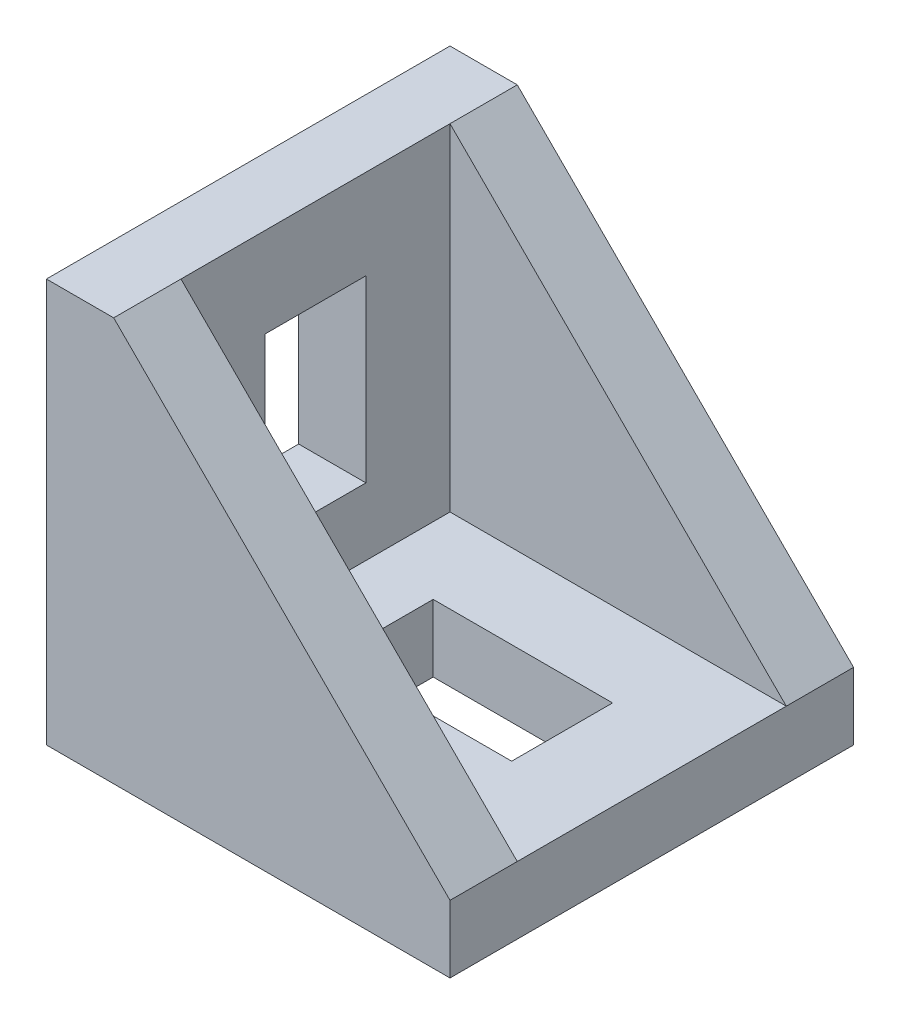
ISO-10303-21;
HEADER;
FILE_DESCRIPTION(('STEP AP214'),'2;1');
FILE_NAME('part.step','',(''),(''),'','','');
FILE_SCHEMA(('AUTOMOTIVE_DESIGN { 1 0 10303 214 1 1 1 1 }'));
ENDSEC;
DATA;
#1=APPLICATION_CONTEXT('core data for automotive mechanical design processes');
#2=APPLICATION_PROTOCOL_DEFINITION('international standard','automotive_design',2000,#1);
#3=PRODUCT_CONTEXT('',#1,'mechanical');
#4=PRODUCT('Part','Part','',(#3));
#5=PRODUCT_RELATED_PRODUCT_CATEGORY('part','',(#4));
#6=PRODUCT_DEFINITION_FORMATION('','',#4);
#7=PRODUCT_DEFINITION_CONTEXT('part definition',#1,'design');
#8=PRODUCT_DEFINITION('design','',#6,#7);
#9=PRODUCT_DEFINITION_SHAPE('','',#8);
#10=(LENGTH_UNIT() NAMED_UNIT(*) SI_UNIT(.MILLI.,.METRE.));
#11=(NAMED_UNIT(*) PLANE_ANGLE_UNIT() SI_UNIT($,.RADIAN.));
#12=(NAMED_UNIT(*) SI_UNIT($,.STERADIAN.) SOLID_ANGLE_UNIT());
#13=UNCERTAINTY_MEASURE_WITH_UNIT(LENGTH_MEASURE(1.E-05),#10,'distance_accuracy_value','');
#14=(GEOMETRIC_REPRESENTATION_CONTEXT(3) GLOBAL_UNCERTAINTY_ASSIGNED_CONTEXT((#13)) GLOBAL_UNIT_ASSIGNED_CONTEXT((#10,
#11,#12)) REPRESENTATION_CONTEXT('',''));
#15=CARTESIAN_POINT('',(0.,0.,0.));
#16=DIRECTION('',(0.,0.,1.));
#17=DIRECTION('',(1.,0.,0.));
#18=AXIS2_PLACEMENT_3D('',#15,#16,#17);
#19=CARTESIAN_POINT('',(9.,9.,9.));
#20=DIRECTION('',(0.,0.,1.));
#21=DIRECTION('',(1.,0.,0.));
#22=AXIS2_PLACEMENT_3D('',#19,#20,#21);
#23=PLANE('',#22);
#24=DIRECTION('',(-1.,0.,0.));
#25=VECTOR('',#24,1.);
#26=CARTESIAN_POINT('',(3.,18.,9.));
#27=LINE('',#26,#25);
#28=CARTESIAN_POINT('',(3.,18.,9.));
#29=VERTEX_POINT('',#28);
#30=CARTESIAN_POINT('',(0.,18.,9.));
#31=VERTEX_POINT('',#30);
#32=EDGE_CURVE('E10',#29,#31,#27,.T.);
#33=ORIENTED_EDGE('',*,*,#32,.T.);
#34=DIRECTION('',(0.,-1.,0.));
#35=VECTOR('',#34,1.);
#36=CARTESIAN_POINT('',(0.,18.,9.));
#37=LINE('',#36,#35);
#38=CARTESIAN_POINT('',(0.,0.,9.));
#39=VERTEX_POINT('',#38);
#40=EDGE_CURVE('E163',#31,#39,#37,.T.);
#41=ORIENTED_EDGE('',*,*,#40,.T.);
#42=DIRECTION('',(1.,0.,0.));
#43=VECTOR('',#42,1.);
#44=CARTESIAN_POINT('',(0.,0.,9.));
#45=LINE('',#44,#43);
#46=CARTESIAN_POINT('',(18.,0.,9.));
#47=VERTEX_POINT('',#46);
#48=EDGE_CURVE('E157',#39,#47,#45,.T.);
#49=ORIENTED_EDGE('',*,*,#48,.T.);
#50=DIRECTION('',(0.,1.,0.));
#51=VECTOR('',#50,1.);
#52=CARTESIAN_POINT('',(18.,0.,9.));
#53=LINE('',#52,#51);
#54=CARTESIAN_POINT('',(18.,3.,9.));
#55=VERTEX_POINT('',#54);
#56=EDGE_CURVE('E160',#47,#55,#53,.T.);
#57=ORIENTED_EDGE('',*,*,#56,.T.);
#58=DIRECTION('',(0.707106781186547,-0.707106781186548,0.));
#59=VECTOR('',#58,1.);
#60=CARTESIAN_POINT('',(3.,18.,9.));
#61=LINE('',#60,#59);
#62=EDGE_CURVE('E276',#29,#55,#61,.T.);
#63=ORIENTED_EDGE('',*,*,#62,.F.);
#64=EDGE_LOOP('',(#33,#41,#49,#57,#63));
#65=FACE_BOUND('',#64,.T.);
#66=ADVANCED_FACE('F16',(#65),#23,.T.);
#67=CARTESIAN_POINT('',(3.,18.,0.));
#68=DIRECTION('',(0.,1.,0.));
#69=DIRECTION('',(1.,0.,0.));
#70=AXIS2_PLACEMENT_3D('',#67,#68,#69);
#71=PLANE('',#70);
#72=DIRECTION('',(0.,0.,1.));
#73=VECTOR('',#72,1.);
#74=CARTESIAN_POINT('',(0.,18.,0.));
#75=LINE('',#74,#73);
#76=CARTESIAN_POINT('',(0.,18.,-9.));
#77=VERTEX_POINT('',#76);
#78=EDGE_CURVE('E25',#77,#31,#75,.T.);
#79=ORIENTED_EDGE('',*,*,#78,.T.);
#80=ORIENTED_EDGE('',*,*,#32,.F.);
#81=DIRECTION('',(0.,0.,-1.));
#82=VECTOR('',#81,1.);
#83=CARTESIAN_POINT('',(3.,18.,0.));
#84=LINE('',#83,#82);
#85=CARTESIAN_POINT('',(3.,18.,6.));
#86=VERTEX_POINT('',#85);
#87=EDGE_CURVE('E265',#29,#86,#84,.T.);
#88=ORIENTED_EDGE('',*,*,#87,.T.);
#89=DIRECTION('',(0.,0.,-1.));
#90=VECTOR('',#89,1.);
#91=CARTESIAN_POINT('',(3.,18.,0.));
#92=LINE('',#91,#90);
#93=CARTESIAN_POINT('',(3.,18.,-6.));
#94=VERTEX_POINT('',#93);
#95=EDGE_CURVE('E297',#86,#94,#92,.T.);
#96=ORIENTED_EDGE('',*,*,#95,.T.);
#97=DIRECTION('',(0.,0.,-1.));
#98=VECTOR('',#97,1.);
#99=CARTESIAN_POINT('',(3.,18.,0.));
#100=LINE('',#99,#98);
#101=CARTESIAN_POINT('',(3.,18.,-9.));
#102=VERTEX_POINT('',#101);
#103=EDGE_CURVE('E342',#94,#102,#100,.T.);
#104=ORIENTED_EDGE('',*,*,#103,.T.);
#105=DIRECTION('',(1.,0.,0.));
#106=VECTOR('',#105,1.);
#107=CARTESIAN_POINT('',(3.,18.,-9.));
#108=LINE('',#107,#106);
#109=EDGE_CURVE('E206',#77,#102,#108,.T.);
#110=ORIENTED_EDGE('',*,*,#109,.F.);
#111=EDGE_LOOP('',(#79,#80,#88,#96,#104,#110));
#112=FACE_BOUND('',#111,.T.);
#113=ADVANCED_FACE('F203',(#112),#71,.T.);
#114=CARTESIAN_POINT('',(0.,18.,0.));
#115=DIRECTION('',(-1.,0.,0.));
#116=DIRECTION('',(0.,0.,1.));
#117=AXIS2_PLACEMENT_3D('',#114,#115,#116);
#118=PLANE('',#117);
#119=DIRECTION('',(0.,0.,-1.));
#120=VECTOR('',#119,1.);
#121=CARTESIAN_POINT('',(0.,6.00000020861626,1.125));
#122=LINE('',#121,#120);
#123=CARTESIAN_POINT('',(0.,6.00000020861626,2.25));
#124=VERTEX_POINT('',#123);
#125=CARTESIAN_POINT('',(0.,6.00000020861626,-2.25));
#126=VERTEX_POINT('',#125);
#127=EDGE_CURVE('E247',#124,#126,#122,.T.);
#128=ORIENTED_EDGE('',*,*,#127,.T.);
#129=DIRECTION('',(0.,1.,0.));
#130=VECTOR('',#129,1.);
#131=CARTESIAN_POINT('',(0.,12.0000001043081,-2.25));
#132=LINE('',#131,#130);
#133=CARTESIAN_POINT('',(0.,14.0000002086163,-2.25));
#134=VERTEX_POINT('',#133);
#135=EDGE_CURVE('E252',#126,#134,#132,.T.);
#136=ORIENTED_EDGE('',*,*,#135,.T.);
#137=DIRECTION('',(0.,0.,1.));
#138=VECTOR('',#137,1.);
#139=CARTESIAN_POINT('',(0.,14.0000002086163,-1.125));
#140=LINE('',#139,#138);
#141=CARTESIAN_POINT('',(0.,14.0000002086163,2.25));
#142=VERTEX_POINT('',#141);
#143=EDGE_CURVE('E258',#134,#142,#140,.T.);
#144=ORIENTED_EDGE('',*,*,#143,.T.);
#145=DIRECTION('',(0.,-1.,0.));
#146=VECTOR('',#145,1.);
#147=CARTESIAN_POINT('',(0.,16.0000001043081,2.25));
#148=LINE('',#147,#146);
#149=EDGE_CURVE('E244',#142,#124,#148,.T.);
#150=ORIENTED_EDGE('',*,*,#149,.T.);
#151=EDGE_LOOP('',(#128,#136,#144,#150));
#152=FACE_BOUND('',#151,.T.);
#153=DIRECTION('',(0.,0.,1.));
#154=VECTOR('',#153,1.);
#155=CARTESIAN_POINT('',(0.,0.,0.));
#156=LINE('',#155,#154);
#157=CARTESIAN_POINT('',(0.,0.,-9.));
#158=VERTEX_POINT('',#157);
#159=EDGE_CURVE('E167',#158,#39,#156,.T.);
#160=ORIENTED_EDGE('',*,*,#159,.T.);
#161=ORIENTED_EDGE('',*,*,#40,.F.);
#162=ORIENTED_EDGE('',*,*,#78,.F.);
#163=DIRECTION('',(0.,1.,0.));
#164=VECTOR('',#163,1.);
#165=CARTESIAN_POINT('',(0.,18.,-9.));
#166=LINE('',#165,#164);
#167=EDGE_CURVE('E185',#158,#77,#166,.T.);
#168=ORIENTED_EDGE('',*,*,#167,.F.);
#169=EDGE_LOOP('',(#160,#161,#162,#168));
#170=FACE_BOUND('',#169,.T.);
#171=ADVANCED_FACE('F209',(#152,#170),#118,.T.);
#172=CARTESIAN_POINT('',(0.,0.,0.));
#173=DIRECTION('',(0.,-1.,0.));
#174=DIRECTION('',(-1.,0.,0.));
#175=AXIS2_PLACEMENT_3D('',#172,#173,#174);
#176=PLANE('',#175);
#177=DIRECTION('',(-1.,0.,0.));
#178=VECTOR('',#177,1.);
#179=CARTESIAN_POINT('',(7.,0.,-2.25));
#180=LINE('',#179,#178);
#181=CARTESIAN_POINT('',(14.,0.,-2.25));
#182=VERTEX_POINT('',#181);
#183=CARTESIAN_POINT('',(6.,0.,-2.25));
#184=VERTEX_POINT('',#183);
#185=EDGE_CURVE('E228',#182,#184,#180,.T.);
#186=ORIENTED_EDGE('',*,*,#185,.T.);
#187=DIRECTION('',(0.,0.,1.));
#188=VECTOR('',#187,1.);
#189=CARTESIAN_POINT('',(6.,0.,-1.125));
#190=LINE('',#189,#188);
#191=CARTESIAN_POINT('',(6.,0.,2.25));
#192=VERTEX_POINT('',#191);
#193=EDGE_CURVE('E234',#184,#192,#190,.T.);
#194=ORIENTED_EDGE('',*,*,#193,.T.);
#195=DIRECTION('',(1.,0.,0.));
#196=VECTOR('',#195,1.);
#197=CARTESIAN_POINT('',(3.,0.,2.25));
#198=LINE('',#197,#196);
#199=CARTESIAN_POINT('',(14.,0.,2.25));
#200=VERTEX_POINT('',#199);
#201=EDGE_CURVE('E240',#192,#200,#198,.T.);
#202=ORIENTED_EDGE('',*,*,#201,.T.);
#203=DIRECTION('',(0.,0.,-1.));
#204=VECTOR('',#203,1.);
#205=CARTESIAN_POINT('',(14.,0.,1.125));
#206=LINE('',#205,#204);
#207=EDGE_CURVE('E222',#200,#182,#206,.T.);
#208=ORIENTED_EDGE('',*,*,#207,.T.);
#209=EDGE_LOOP('',(#186,#194,#202,#208));
#210=FACE_BOUND('',#209,.T.);
#211=DIRECTION('',(0.,0.,1.));
#212=VECTOR('',#211,1.);
#213=CARTESIAN_POINT('',(18.,0.,0.));
#214=LINE('',#213,#212);
#215=CARTESIAN_POINT('',(18.,0.,-9.));
#216=VERTEX_POINT('',#215);
#217=EDGE_CURVE('E168',#216,#47,#214,.T.);
#218=ORIENTED_EDGE('',*,*,#217,.T.);
#219=ORIENTED_EDGE('',*,*,#48,.F.);
#220=ORIENTED_EDGE('',*,*,#159,.F.);
#221=DIRECTION('',(-1.,0.,0.));
#222=VECTOR('',#221,1.);
#223=CARTESIAN_POINT('',(0.,0.,-9.));
#224=LINE('',#223,#222);
#225=EDGE_CURVE('E173',#216,#158,#224,.T.);
#226=ORIENTED_EDGE('',*,*,#225,.F.);
#227=EDGE_LOOP('',(#218,#219,#220,#226));
#228=FACE_BOUND('',#227,.T.);
#229=ADVANCED_FACE('F171',(#210,#228),#176,.T.);
#230=CARTESIAN_POINT('',(18.,0.,0.));
#231=DIRECTION('',(1.,0.,0.));
#232=DIRECTION('',(0.,1.,0.));
#233=AXIS2_PLACEMENT_3D('',#230,#231,#232);
#234=PLANE('',#233);
#235=DIRECTION('',(0.,0.,1.));
#236=VECTOR('',#235,1.);
#237=CARTESIAN_POINT('',(18.,3.,0.));
#238=LINE('',#237,#236);
#239=CARTESIAN_POINT('',(18.,3.,-9.));
#240=VERTEX_POINT('',#239);
#241=CARTESIAN_POINT('',(18.,3.,-6.));
#242=VERTEX_POINT('',#241);
#243=EDGE_CURVE('E327',#240,#242,#238,.T.);
#244=ORIENTED_EDGE('',*,*,#243,.T.);
#245=DIRECTION('',(0.,0.,1.));
#246=VECTOR('',#245,1.);
#247=CARTESIAN_POINT('',(18.,3.,0.));
#248=LINE('',#247,#246);
#249=CARTESIAN_POINT('',(18.,3.,6.));
#250=VERTEX_POINT('',#249);
#251=EDGE_CURVE('E308',#242,#250,#248,.T.);
#252=ORIENTED_EDGE('',*,*,#251,.T.);
#253=DIRECTION('',(0.,0.,1.));
#254=VECTOR('',#253,1.);
#255=CARTESIAN_POINT('',(18.,3.,0.));
#256=LINE('',#255,#254);
#257=EDGE_CURVE('E182',#250,#55,#256,.T.);
#258=ORIENTED_EDGE('',*,*,#257,.T.);
#259=ORIENTED_EDGE('',*,*,#56,.F.);
#260=ORIENTED_EDGE('',*,*,#217,.F.);
#261=DIRECTION('',(0.,-1.,0.));
#262=VECTOR('',#261,1.);
#263=CARTESIAN_POINT('',(18.,0.,-9.));
#264=LINE('',#263,#262);
#265=EDGE_CURVE('E213',#240,#216,#264,.T.);
#266=ORIENTED_EDGE('',*,*,#265,.F.);
#267=EDGE_LOOP('',(#244,#252,#258,#259,#260,#266));
#268=FACE_BOUND('',#267,.T.);
#269=ADVANCED_FACE('F179',(#268),#234,.T.);
#270=CARTESIAN_POINT('',(9.,9.,-9.));
#271=DIRECTION('',(0.,0.,-1.));
#272=DIRECTION('',(0.,-1.,0.));
#273=AXIS2_PLACEMENT_3D('',#270,#271,#272);
#274=PLANE('',#273);
#275=ORIENTED_EDGE('',*,*,#109,.T.);
#276=DIRECTION('',(0.707106781186547,-0.707106781186548,0.));
#277=VECTOR('',#276,1.);
#278=CARTESIAN_POINT('',(3.,18.,-9.));
#279=LINE('',#278,#277);
#280=EDGE_CURVE('E345',#102,#240,#279,.T.);
#281=ORIENTED_EDGE('',*,*,#280,.T.);
#282=ORIENTED_EDGE('',*,*,#265,.T.);
#283=ORIENTED_EDGE('',*,*,#225,.T.);
#284=ORIENTED_EDGE('',*,*,#167,.T.);
#285=EDGE_LOOP('',(#275,#281,#282,#283,#284));
#286=FACE_BOUND('',#285,.T.);
#287=ADVANCED_FACE('F211',(#286),#274,.T.);
#288=CARTESIAN_POINT('',(14.,0.,2.25));
#289=DIRECTION('',(1.,0.,0.));
#290=DIRECTION('',(0.,-1.,0.));
#291=AXIS2_PLACEMENT_3D('',#288,#289,#290);
#292=PLANE('',#291);
#293=DIRECTION('',(0.,0.,1.));
#294=VECTOR('',#293,1.);
#295=CARTESIAN_POINT('',(14.,3.,1.125));
#296=LINE('',#295,#294);
#297=CARTESIAN_POINT('',(14.,3.,-2.25));
#298=VERTEX_POINT('',#297);
#299=CARTESIAN_POINT('',(14.,3.,2.25));
#300=VERTEX_POINT('',#299);
#301=EDGE_CURVE('E303',#298,#300,#296,.T.);
#302=ORIENTED_EDGE('',*,*,#301,.F.);
#303=DIRECTION('',(0.,1.,0.));
#304=VECTOR('',#303,1.);
#305=CARTESIAN_POINT('',(14.,0.,-2.25));
#306=LINE('',#305,#304);
#307=EDGE_CURVE('E225',#182,#298,#306,.T.);
#308=ORIENTED_EDGE('',*,*,#307,.F.);
#309=ORIENTED_EDGE('',*,*,#207,.F.);
#310=DIRECTION('',(0.,1.,0.));
#311=VECTOR('',#310,1.);
#312=CARTESIAN_POINT('',(14.,0.,2.25));
#313=LINE('',#312,#311);
#314=EDGE_CURVE('E241',#200,#300,#313,.T.);
#315=ORIENTED_EDGE('',*,*,#314,.T.);
#316=EDGE_LOOP('',(#302,#308,#309,#315));
#317=FACE_BOUND('',#316,.T.);
#318=ADVANCED_FACE('F403',(#317),#292,.F.);
#319=CARTESIAN_POINT('',(14.,0.,-2.25));
#320=DIRECTION('',(0.,0.,-1.));
#321=DIRECTION('',(0.,-1.,0.));
#322=AXIS2_PLACEMENT_3D('',#319,#320,#321);
#323=PLANE('',#322);
#324=DIRECTION('',(1.,0.,0.));
#325=VECTOR('',#324,1.);
#326=CARTESIAN_POINT('',(16.,3.,-2.25));
#327=LINE('',#326,#325);
#328=CARTESIAN_POINT('',(6.,3.,-2.25));
#329=VERTEX_POINT('',#328);
#330=EDGE_CURVE('E307',#329,#298,#327,.T.);
#331=ORIENTED_EDGE('',*,*,#330,.F.);
#332=DIRECTION('',(0.,1.,0.));
#333=VECTOR('',#332,1.);
#334=CARTESIAN_POINT('',(6.,0.,-2.25));
#335=LINE('',#334,#333);
#336=EDGE_CURVE('E231',#184,#329,#335,.T.);
#337=ORIENTED_EDGE('',*,*,#336,.F.);
#338=ORIENTED_EDGE('',*,*,#185,.F.);
#339=ORIENTED_EDGE('',*,*,#307,.T.);
#340=EDGE_LOOP('',(#331,#337,#338,#339));
#341=FACE_BOUND('',#340,.T.);
#342=ADVANCED_FACE('F404',(#341),#323,.F.);
#343=CARTESIAN_POINT('',(6.,0.,-2.25));
#344=DIRECTION('',(-1.,0.,0.));
#345=DIRECTION('',(0.,0.,1.));
#346=AXIS2_PLACEMENT_3D('',#343,#344,#345);
#347=PLANE('',#346);
#348=DIRECTION('',(0.,0.,-1.));
#349=VECTOR('',#348,1.);
#350=CARTESIAN_POINT('',(6.,3.,-1.125));
#351=LINE('',#350,#349);
#352=CARTESIAN_POINT('',(6.,3.,2.25));
#353=VERTEX_POINT('',#352);
#354=EDGE_CURVE('E298',#353,#329,#351,.T.);
#355=ORIENTED_EDGE('',*,*,#354,.F.);
#356=DIRECTION('',(0.,1.,0.));
#357=VECTOR('',#356,1.);
#358=CARTESIAN_POINT('',(6.,0.,2.25));
#359=LINE('',#358,#357);
#360=EDGE_CURVE('E237',#192,#353,#359,.T.);
#361=ORIENTED_EDGE('',*,*,#360,.F.);
#362=ORIENTED_EDGE('',*,*,#193,.F.);
#363=ORIENTED_EDGE('',*,*,#336,.T.);
#364=EDGE_LOOP('',(#355,#361,#362,#363));
#365=FACE_BOUND('',#364,.T.);
#366=ADVANCED_FACE('F407',(#365),#347,.F.);
#367=CARTESIAN_POINT('',(6.,0.,2.25));
#368=DIRECTION('',(0.,0.,1.));
#369=DIRECTION('',(1.,0.,0.));
#370=AXIS2_PLACEMENT_3D('',#367,#368,#369);
#371=PLANE('',#370);
#372=DIRECTION('',(-1.,0.,0.));
#373=VECTOR('',#372,1.);
#374=CARTESIAN_POINT('',(12.,3.,2.25));
#375=LINE('',#374,#373);
#376=EDGE_CURVE('E302',#300,#353,#375,.T.);
#377=ORIENTED_EDGE('',*,*,#376,.F.);
#378=ORIENTED_EDGE('',*,*,#314,.F.);
#379=ORIENTED_EDGE('',*,*,#201,.F.);
#380=ORIENTED_EDGE('',*,*,#360,.T.);
#381=EDGE_LOOP('',(#377,#378,#379,#380));
#382=FACE_BOUND('',#381,.T.);
#383=ADVANCED_FACE('F411',(#382),#371,.F.);
#384=CARTESIAN_POINT('',(0.,14.0000002086163,2.25));
#385=DIRECTION('',(0.,0.,1.));
#386=DIRECTION('',(1.,0.,0.));
#387=AXIS2_PLACEMENT_3D('',#384,#385,#386);
#388=PLANE('',#387);
#389=DIRECTION('',(0.,1.,0.));
#390=VECTOR('',#389,1.);
#391=CARTESIAN_POINT('',(3.,8.50000010430813,2.25));
#392=LINE('',#391,#390);
#393=CARTESIAN_POINT('',(3.,6.00000020861626,2.25));
#394=VERTEX_POINT('',#393);
#395=CARTESIAN_POINT('',(3.,14.0000002086163,2.25));
#396=VERTEX_POINT('',#395);
#397=EDGE_CURVE('E289',#394,#396,#392,.T.);
#398=ORIENTED_EDGE('',*,*,#397,.F.);
#399=DIRECTION('',(1.,0.,0.));
#400=VECTOR('',#399,1.);
#401=CARTESIAN_POINT('',(0.,6.00000020861626,2.25));
#402=LINE('',#401,#400);
#403=EDGE_CURVE('E245',#124,#394,#402,.T.);
#404=ORIENTED_EDGE('',*,*,#403,.F.);
#405=ORIENTED_EDGE('',*,*,#149,.F.);
#406=DIRECTION('',(1.,0.,0.));
#407=VECTOR('',#406,1.);
#408=CARTESIAN_POINT('',(0.,14.0000002086163,2.25));
#409=LINE('',#408,#407);
#410=EDGE_CURVE('E262',#142,#396,#409,.T.);
#411=ORIENTED_EDGE('',*,*,#410,.T.);
#412=EDGE_LOOP('',(#398,#404,#405,#411));
#413=FACE_BOUND('',#412,.T.);
#414=ADVANCED_FACE('F413',(#413),#388,.F.);
#415=CARTESIAN_POINT('',(0.,6.00000020861626,2.25));
#416=DIRECTION('',(0.,-1.,0.));
#417=DIRECTION('',(0.,0.,-1.));
#418=AXIS2_PLACEMENT_3D('',#415,#416,#417);
#419=PLANE('',#418);
#420=DIRECTION('',(0.,0.,1.));
#421=VECTOR('',#420,1.);
#422=CARTESIAN_POINT('',(3.,6.00000020861626,1.125));
#423=LINE('',#422,#421);
#424=CARTESIAN_POINT('',(3.,6.00000020861626,-2.25));
#425=VERTEX_POINT('',#424);
#426=EDGE_CURVE('E293',#425,#394,#423,.T.);
#427=ORIENTED_EDGE('',*,*,#426,.F.);
#428=DIRECTION('',(1.,0.,0.));
#429=VECTOR('',#428,1.);
#430=CARTESIAN_POINT('',(0.,6.00000020861626,-2.25));
#431=LINE('',#430,#429);
#432=EDGE_CURVE('E249',#126,#425,#431,.T.);
#433=ORIENTED_EDGE('',*,*,#432,.F.);
#434=ORIENTED_EDGE('',*,*,#127,.F.);
#435=ORIENTED_EDGE('',*,*,#403,.T.);
#436=EDGE_LOOP('',(#427,#433,#434,#435));
#437=FACE_BOUND('',#436,.T.);
#438=ADVANCED_FACE('F416',(#437),#419,.F.);
#439=CARTESIAN_POINT('',(0.,6.00000020861626,-2.25));
#440=DIRECTION('',(0.,0.,-1.));
#441=DIRECTION('',(0.,-1.,0.));
#442=AXIS2_PLACEMENT_3D('',#439,#440,#441);
#443=PLANE('',#442);
#444=DIRECTION('',(0.,-1.,0.));
#445=VECTOR('',#444,1.);
#446=CARTESIAN_POINT('',(3.,4.50000010430813,-2.25));
#447=LINE('',#446,#445);
#448=CARTESIAN_POINT('',(3.,14.0000002086163,-2.25));
#449=VERTEX_POINT('',#448);
#450=EDGE_CURVE('E279',#449,#425,#447,.T.);
#451=ORIENTED_EDGE('',*,*,#450,.F.);
#452=DIRECTION('',(1.,0.,0.));
#453=VECTOR('',#452,1.);
#454=CARTESIAN_POINT('',(0.,14.0000002086163,-2.25));
#455=LINE('',#454,#453);
#456=EDGE_CURVE('E255',#134,#449,#455,.T.);
#457=ORIENTED_EDGE('',*,*,#456,.F.);
#458=ORIENTED_EDGE('',*,*,#135,.F.);
#459=ORIENTED_EDGE('',*,*,#432,.T.);
#460=EDGE_LOOP('',(#451,#457,#458,#459));
#461=FACE_BOUND('',#460,.T.);
#462=ADVANCED_FACE('F423',(#461),#443,.F.);
#463=CARTESIAN_POINT('',(0.,14.0000002086163,-2.25));
#464=DIRECTION('',(0.,1.,0.));
#465=DIRECTION('',(1.,0.,0.));
#466=AXIS2_PLACEMENT_3D('',#463,#464,#465);
#467=PLANE('',#466);
#468=DIRECTION('',(0.,0.,-1.));
#469=VECTOR('',#468,1.);
#470=CARTESIAN_POINT('',(3.,14.0000002086163,-1.125));
#471=LINE('',#470,#469);
#472=EDGE_CURVE('E285',#396,#449,#471,.T.);
#473=ORIENTED_EDGE('',*,*,#472,.F.);
#474=ORIENTED_EDGE('',*,*,#410,.F.);
#475=ORIENTED_EDGE('',*,*,#143,.F.);
#476=ORIENTED_EDGE('',*,*,#456,.T.);
#477=EDGE_LOOP('',(#473,#474,#475,#476));
#478=FACE_BOUND('',#477,.T.);
#479=ADVANCED_FACE('F385',(#478),#467,.F.);
#480=CARTESIAN_POINT('',(10.5,10.5,6.));
#481=DIRECTION('',(0.,0.,-1.));
#482=DIRECTION('',(0.,-1.,0.));
#483=AXIS2_PLACEMENT_3D('',#480,#481,#482);
#484=PLANE('',#483);
#485=DIRECTION('',(0.,-1.,0.));
#486=VECTOR('',#485,1.);
#487=CARTESIAN_POINT('',(3.,6.75,6.));
#488=LINE('',#487,#486);
#489=CARTESIAN_POINT('',(3.,3.,6.));
#490=VERTEX_POINT('',#489);
#491=EDGE_CURVE('E294',#86,#490,#488,.T.);
#492=ORIENTED_EDGE('',*,*,#491,.F.);
#493=DIRECTION('',(0.707106781186547,-0.707106781186548,0.));
#494=VECTOR('',#493,1.);
#495=CARTESIAN_POINT('',(3.,18.,6.));
#496=LINE('',#495,#494);
#497=EDGE_CURVE('E268',#86,#250,#496,.T.);
#498=ORIENTED_EDGE('',*,*,#497,.T.);
#499=DIRECTION('',(1.,0.,0.));
#500=VECTOR('',#499,1.);
#501=CARTESIAN_POINT('',(14.25,3.,6.));
#502=LINE('',#501,#500);
#503=EDGE_CURVE('E311',#490,#250,#502,.T.);
#504=ORIENTED_EDGE('',*,*,#503,.F.);
#505=EDGE_LOOP('',(#492,#498,#504));
#506=FACE_BOUND('',#505,.T.);
#507=ADVANCED_FACE('F373',(#506),#484,.T.);
#508=CARTESIAN_POINT('',(3.,18.,9.));
#509=DIRECTION('',(0.707106781186548,0.707106781186547,0.));
#510=DIRECTION('',(0.,0.,-1.));
#511=AXIS2_PLACEMENT_3D('',#508,#509,#510);
#512=PLANE('',#511);
#513=ORIENTED_EDGE('',*,*,#62,.T.);
#514=ORIENTED_EDGE('',*,*,#257,.F.);
#515=ORIENTED_EDGE('',*,*,#497,.F.);
#516=ORIENTED_EDGE('',*,*,#87,.F.);
#517=EDGE_LOOP('',(#513,#514,#515,#516));
#518=FACE_BOUND('',#517,.T.);
#519=ADVANCED_FACE('F375',(#518),#512,.T.);
#520=CARTESIAN_POINT('',(3.,3.,0.));
#521=DIRECTION('',(1.,0.,0.));
#522=DIRECTION('',(0.,1.,0.));
#523=AXIS2_PLACEMENT_3D('',#520,#521,#522);
#524=PLANE('',#523);
#525=ORIENTED_EDGE('',*,*,#426,.T.);
#526=ORIENTED_EDGE('',*,*,#397,.T.);
#527=ORIENTED_EDGE('',*,*,#472,.T.);
#528=ORIENTED_EDGE('',*,*,#450,.T.);
#529=EDGE_LOOP('',(#525,#526,#527,#528));
#530=FACE_BOUND('',#529,.T.);
#531=DIRECTION('',(0.,1.,0.));
#532=VECTOR('',#531,1.);
#533=CARTESIAN_POINT('',(3.,6.75,-6.));
#534=LINE('',#533,#532);
#535=CARTESIAN_POINT('',(3.,3.,-6.));
#536=VERTEX_POINT('',#535);
#537=EDGE_CURVE('E323',#536,#94,#534,.T.);
#538=ORIENTED_EDGE('',*,*,#537,.T.);
#539=ORIENTED_EDGE('',*,*,#95,.F.);
#540=ORIENTED_EDGE('',*,*,#491,.T.);
#541=DIRECTION('',(0.,0.,1.));
#542=VECTOR('',#541,1.);
#543=CARTESIAN_POINT('',(3.,3.,0.));
#544=LINE('',#543,#542);
#545=EDGE_CURVE('E315',#536,#490,#544,.T.);
#546=ORIENTED_EDGE('',*,*,#545,.F.);
#547=EDGE_LOOP('',(#538,#539,#540,#546));
#548=FACE_BOUND('',#547,.T.);
#549=ADVANCED_FACE('F361',(#530,#548),#524,.T.);
#550=CARTESIAN_POINT('',(18.,3.,0.));
#551=DIRECTION('',(0.,1.,0.));
#552=DIRECTION('',(1.,0.,0.));
#553=AXIS2_PLACEMENT_3D('',#550,#551,#552);
#554=PLANE('',#553);
#555=ORIENTED_EDGE('',*,*,#330,.T.);
#556=ORIENTED_EDGE('',*,*,#301,.T.);
#557=ORIENTED_EDGE('',*,*,#376,.T.);
#558=ORIENTED_EDGE('',*,*,#354,.T.);
#559=EDGE_LOOP('',(#555,#556,#557,#558));
#560=FACE_BOUND('',#559,.T.);
#561=DIRECTION('',(-1.,0.,0.));
#562=VECTOR('',#561,1.);
#563=CARTESIAN_POINT('',(14.25,3.,-6.));
#564=LINE('',#563,#562);
#565=EDGE_CURVE('E319',#242,#536,#564,.T.);
#566=ORIENTED_EDGE('',*,*,#565,.T.);
#567=ORIENTED_EDGE('',*,*,#545,.T.);
#568=ORIENTED_EDGE('',*,*,#503,.T.);
#569=ORIENTED_EDGE('',*,*,#251,.F.);
#570=EDGE_LOOP('',(#566,#567,#568,#569));
#571=FACE_BOUND('',#570,.T.);
#572=ADVANCED_FACE('F370',(#560,#571),#554,.T.);
#573=CARTESIAN_POINT('',(10.5,10.5,-6.));
#574=DIRECTION('',(0.,0.,-1.));
#575=DIRECTION('',(0.,-1.,0.));
#576=AXIS2_PLACEMENT_3D('',#573,#574,#575);
#577=PLANE('',#576);
#578=ORIENTED_EDGE('',*,*,#537,.F.);
#579=ORIENTED_EDGE('',*,*,#565,.F.);
#580=DIRECTION('',(0.707106781186547,-0.707106781186548,0.));
#581=VECTOR('',#580,1.);
#582=CARTESIAN_POINT('',(3.,18.,-6.));
#583=LINE('',#582,#581);
#584=EDGE_CURVE('E338',#94,#242,#583,.T.);
#585=ORIENTED_EDGE('',*,*,#584,.F.);
#586=EDGE_LOOP('',(#578,#579,#585));
#587=FACE_BOUND('',#586,.T.);
#588=ADVANCED_FACE('F364',(#587),#577,.F.);
#589=CARTESIAN_POINT('',(3.,18.,-9.));
#590=DIRECTION('',(-0.707106781186548,-0.707106781186547,0.));
#591=DIRECTION('',(-0.707106781186547,0.707106781186548,0.));
#592=AXIS2_PLACEMENT_3D('',#589,#590,#591);
#593=PLANE('',#592);
#594=ORIENTED_EDGE('',*,*,#280,.F.);
#595=ORIENTED_EDGE('',*,*,#103,.F.);
#596=ORIENTED_EDGE('',*,*,#584,.T.);
#597=ORIENTED_EDGE('',*,*,#243,.F.);
#598=EDGE_LOOP('',(#594,#595,#596,#597));
#599=FACE_BOUND('',#598,.T.);
#600=ADVANCED_FACE('F367',(#599),#593,.F.);
#601=CLOSED_SHELL('',(#66,#113,#171,#229,#269,#287,#318,#342,#366,#383,#414,#438,#462,#479,#507,
#519,#549,#572,#588,#600));
#602=MANIFOLD_SOLID_BREP('B1',#601);
#603=ADVANCED_BREP_SHAPE_REPRESENTATION('',(#18,#602),#14);
#604=SHAPE_DEFINITION_REPRESENTATION(#9,#603);
ENDSEC;
END-ISO-10303-21;
